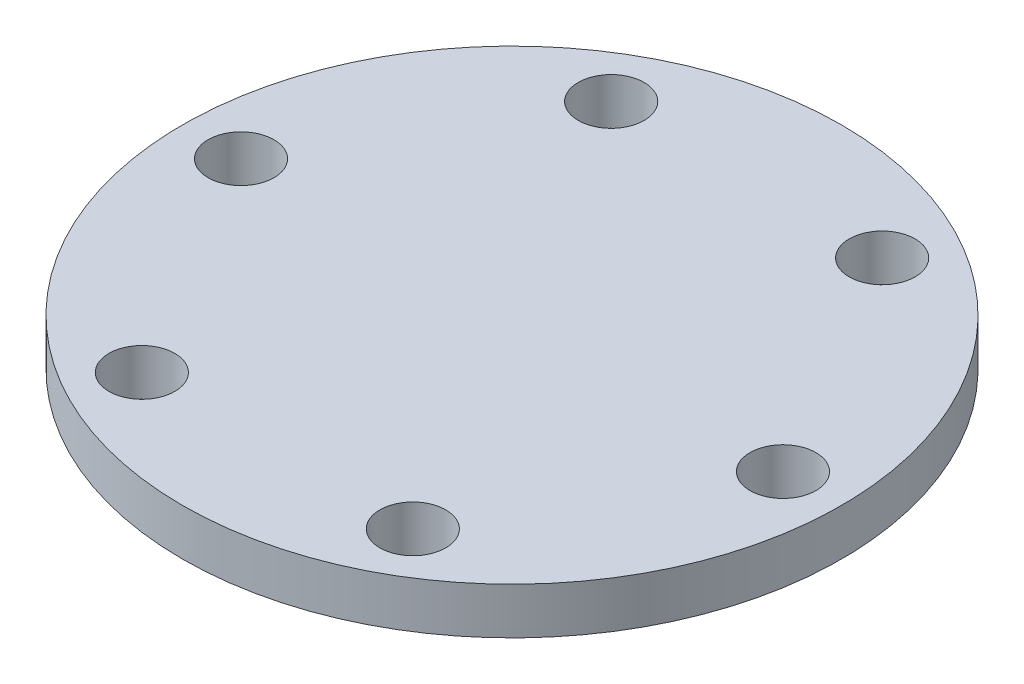
ISO-10303-21;
HEADER;
FILE_DESCRIPTION(('STEP AP214'),'2;1');
FILE_NAME('part.step','',(''),(''),'','','');
FILE_SCHEMA(('AUTOMOTIVE_DESIGN { 1 0 10303 214 1 1 1 1 }'));
ENDSEC;
DATA;
#1=APPLICATION_CONTEXT('core data for automotive mechanical design processes');
#2=APPLICATION_PROTOCOL_DEFINITION('international standard','automotive_design',2000,#1);
#3=PRODUCT_CONTEXT('',#1,'mechanical');
#4=PRODUCT('Part','Part','',(#3));
#5=PRODUCT_RELATED_PRODUCT_CATEGORY('part','',(#4));
#6=PRODUCT_DEFINITION_FORMATION('','',#4);
#7=PRODUCT_DEFINITION_CONTEXT('part definition',#1,'design');
#8=PRODUCT_DEFINITION('design','',#6,#7);
#9=PRODUCT_DEFINITION_SHAPE('','',#8);
#10=(LENGTH_UNIT() NAMED_UNIT(*) SI_UNIT(.MILLI.,.METRE.));
#11=(NAMED_UNIT(*) PLANE_ANGLE_UNIT() SI_UNIT($,.RADIAN.));
#12=(NAMED_UNIT(*) SI_UNIT($,.STERADIAN.) SOLID_ANGLE_UNIT());
#13=UNCERTAINTY_MEASURE_WITH_UNIT(LENGTH_MEASURE(1.E-05),#10,'distance_accuracy_value','');
#14=(GEOMETRIC_REPRESENTATION_CONTEXT(3) GLOBAL_UNCERTAINTY_ASSIGNED_CONTEXT((#13)) GLOBAL_UNIT_ASSIGNED_CONTEXT((#10,
#11,#12)) REPRESENTATION_CONTEXT('',''));
#15=CARTESIAN_POINT('',(0.,0.,0.));
#16=DIRECTION('',(0.,0.,1.));
#17=DIRECTION('',(1.,0.,0.));
#18=AXIS2_PLACEMENT_3D('',#15,#16,#17);
#19=CARTESIAN_POINT('',(18.5000000000009,233.315,-6.39585606698739E-13));
#20=DIRECTION('',(0.,1.,0.));
#21=DIRECTION('',(0.,0.,1.));
#22=AXIS2_PLACEMENT_3D('',#19,#20,#21);
#23=CYLINDRICAL_SURFACE('',#22,2.24999999999973);
#24=CARTESIAN_POINT('',(18.5000000000009,233.315,-6.39585606698739E-13));
#25=DIRECTION('',(0.,1.,0.));
#26=DIRECTION('',(0.,0.,1.));
#27=AXIS2_PLACEMENT_3D('',#24,#25,#26);
#28=CIRCLE('',#27,2.24999999999973);
#29=CARTESIAN_POINT('',(18.5000000000009,233.315,2.24999999999909));
#30=VERTEX_POINT('',#29);
#31=EDGE_CURVE('E52',#30,#30,#28,.T.);
#32=ORIENTED_EDGE('',*,*,#31,.F.);
#33=EDGE_LOOP('',(#32));
#34=FACE_BOUND('',#33,.T.);
#35=CARTESIAN_POINT('',(18.5000000000009,236.49,-6.39585606698739E-13));
#36=DIRECTION('',(0.,1.,0.));
#37=DIRECTION('',(0.,0.,1.));
#38=AXIS2_PLACEMENT_3D('',#35,#36,#37);
#39=CIRCLE('',#38,2.24999999999973);
#40=CARTESIAN_POINT('',(18.5000000000009,236.49,2.24999999999909));
#41=VERTEX_POINT('',#40);
#42=EDGE_CURVE('E81',#41,#41,#39,.T.);
#43=ORIENTED_EDGE('',*,*,#42,.T.);
#44=EDGE_LOOP('',(#43));
#45=FACE_BOUND('',#44,.T.);
#46=ADVANCED_FACE('F43',(#34,#45),#23,.F.);
#47=CARTESIAN_POINT('',(9.24999999999991,233.315,-16.0214699700122));
#48=DIRECTION('',(0.,1.,0.));
#49=DIRECTION('',(0.,0.,1.));
#50=AXIS2_PLACEMENT_3D('',#47,#48,#49);
#51=CYLINDRICAL_SURFACE('',#50,2.25);
#52=CARTESIAN_POINT('',(9.24999999999991,233.315,-16.0214699700122));
#53=DIRECTION('',(0.,1.,0.));
#54=DIRECTION('',(0.,0.,1.));
#55=AXIS2_PLACEMENT_3D('',#52,#53,#54);
#56=CIRCLE('',#55,2.25);
#57=CARTESIAN_POINT('',(9.24999999999991,233.315,-13.7714699700122));
#58=VERTEX_POINT('',#57);
#59=EDGE_CURVE('E58',#58,#58,#56,.T.);
#60=ORIENTED_EDGE('',*,*,#59,.F.);
#61=EDGE_LOOP('',(#60));
#62=FACE_BOUND('',#61,.T.);
#63=CARTESIAN_POINT('',(9.24999999999991,236.49,-16.0214699700122));
#64=DIRECTION('',(0.,1.,0.));
#65=DIRECTION('',(0.,0.,1.));
#66=AXIS2_PLACEMENT_3D('',#63,#64,#65);
#67=CIRCLE('',#66,2.25);
#68=CARTESIAN_POINT('',(9.24999999999991,236.49,-13.7714699700122));
#69=VERTEX_POINT('',#68);
#70=EDGE_CURVE('E78',#69,#69,#67,.T.);
#71=ORIENTED_EDGE('',*,*,#70,.T.);
#72=EDGE_LOOP('',(#71));
#73=FACE_BOUND('',#72,.T.);
#74=ADVANCED_FACE('F115',(#62,#73),#51,.F.);
#75=CARTESIAN_POINT('',(0.,233.315,0.));
#76=DIRECTION('',(0.,1.,0.));
#77=DIRECTION('',(0.,0.,1.));
#78=AXIS2_PLACEMENT_3D('',#75,#76,#77);
#79=CYLINDRICAL_SURFACE('',#78,22.5);
#80=CARTESIAN_POINT('',(0.,233.315,0.));
#81=DIRECTION('',(0.,1.,0.));
#82=DIRECTION('',(0.,0.,1.));
#83=AXIS2_PLACEMENT_3D('',#80,#81,#82);
#84=CIRCLE('',#83,22.5);
#85=CARTESIAN_POINT('',(0.,233.315,22.5));
#86=VERTEX_POINT('',#85);
#87=EDGE_CURVE('E105',#86,#86,#84,.T.);
#88=ORIENTED_EDGE('',*,*,#87,.T.);
#89=EDGE_LOOP('',(#88));
#90=FACE_BOUND('',#89,.T.);
#91=CARTESIAN_POINT('',(0.,236.49,0.));
#92=DIRECTION('',(0.,1.,0.));
#93=DIRECTION('',(0.,0.,1.));
#94=AXIS2_PLACEMENT_3D('',#91,#92,#93);
#95=CIRCLE('',#94,22.5);
#96=CARTESIAN_POINT('',(0.,236.49,22.5));
#97=VERTEX_POINT('',#96);
#98=EDGE_CURVE('E74',#97,#97,#95,.T.);
#99=ORIENTED_EDGE('',*,*,#98,.F.);
#100=EDGE_LOOP('',(#99));
#101=FACE_BOUND('',#100,.T.);
#102=ADVANCED_FACE('F118',(#90,#101),#79,.T.);
#103=CARTESIAN_POINT('',(-18.4999999999991,233.315,1.68829830522852E-12));
#104=DIRECTION('',(0.,1.,0.));
#105=DIRECTION('',(0.,0.,1.));
#106=AXIS2_PLACEMENT_3D('',#103,#104,#105);
#107=CYLINDRICAL_SURFACE('',#106,2.25000000000184);
#108=CARTESIAN_POINT('',(-18.4999999999991,233.315,1.68829830522852E-12));
#109=DIRECTION('',(0.,1.,0.));
#110=DIRECTION('',(0.,0.,1.));
#111=AXIS2_PLACEMENT_3D('',#108,#109,#110);
#112=CIRCLE('',#111,2.25000000000184);
#113=CARTESIAN_POINT('',(-18.4999999999991,233.315,2.25000000000353));
#114=VERTEX_POINT('',#113);
#115=EDGE_CURVE('E99',#114,#114,#112,.T.);
#116=ORIENTED_EDGE('',*,*,#115,.F.);
#117=EDGE_LOOP('',(#116));
#118=FACE_BOUND('',#117,.T.);
#119=CARTESIAN_POINT('',(-18.4999999999991,236.49,1.68829830522852E-12));
#120=DIRECTION('',(0.,1.,0.));
#121=DIRECTION('',(0.,0.,1.));
#122=AXIS2_PLACEMENT_3D('',#119,#120,#121);
#123=CIRCLE('',#122,2.25000000000184);
#124=CARTESIAN_POINT('',(-18.4999999999991,236.49,2.25000000000353));
#125=VERTEX_POINT('',#124);
#126=EDGE_CURVE('E70',#125,#125,#123,.T.);
#127=ORIENTED_EDGE('',*,*,#126,.T.);
#128=EDGE_LOOP('',(#127));
#129=FACE_BOUND('',#128,.T.);
#130=ADVANCED_FACE('F145',(#118,#129),#107,.F.);
#131=CARTESIAN_POINT('',(-9.2499999999981,233.315,16.0214699700132));
#132=DIRECTION('',(0.,1.,0.));
#133=DIRECTION('',(0.,0.,1.));
#134=AXIS2_PLACEMENT_3D('',#131,#132,#133);
#135=CYLINDRICAL_SURFACE('',#134,2.25000000000151);
#136=CARTESIAN_POINT('',(-9.2499999999981,233.315,16.0214699700132));
#137=DIRECTION('',(0.,1.,0.));
#138=DIRECTION('',(0.,0.,1.));
#139=AXIS2_PLACEMENT_3D('',#136,#137,#138);
#140=CIRCLE('',#139,2.25000000000151);
#141=CARTESIAN_POINT('',(-9.2499999999981,233.315,18.2714699700147));
#142=VERTEX_POINT('',#141);
#143=EDGE_CURVE('E93',#142,#142,#140,.T.);
#144=ORIENTED_EDGE('',*,*,#143,.F.);
#145=EDGE_LOOP('',(#144));
#146=FACE_BOUND('',#145,.T.);
#147=CARTESIAN_POINT('',(-9.2499999999981,236.49,16.0214699700132));
#148=DIRECTION('',(0.,1.,0.));
#149=DIRECTION('',(0.,0.,1.));
#150=AXIS2_PLACEMENT_3D('',#147,#148,#149);
#151=CIRCLE('',#150,2.25000000000151);
#152=CARTESIAN_POINT('',(-9.2499999999981,236.49,18.2714699700147));
#153=VERTEX_POINT('',#152);
#154=EDGE_CURVE('E66',#153,#153,#151,.T.);
#155=ORIENTED_EDGE('',*,*,#154,.T.);
#156=EDGE_LOOP('',(#155));
#157=FACE_BOUND('',#156,.T.);
#158=ADVANCED_FACE('F148',(#146,#157),#135,.F.);
#159=CARTESIAN_POINT('',(-9.25000000000011,233.315,-16.021469970011));
#160=DIRECTION('',(0.,1.,0.));
#161=DIRECTION('',(0.,0.,1.));
#162=AXIS2_PLACEMENT_3D('',#159,#160,#161);
#163=CYLINDRICAL_SURFACE('',#162,2.25000000000118);
#164=CARTESIAN_POINT('',(-9.25000000000011,233.315,-16.021469970011));
#165=DIRECTION('',(0.,1.,0.));
#166=DIRECTION('',(0.,0.,1.));
#167=AXIS2_PLACEMENT_3D('',#164,#165,#166);
#168=CIRCLE('',#167,2.25000000000118);
#169=CARTESIAN_POINT('',(-9.25000000000011,233.315,-13.7714699700098));
#170=VERTEX_POINT('',#169);
#171=EDGE_CURVE('E88',#170,#170,#168,.T.);
#172=ORIENTED_EDGE('',*,*,#171,.F.);
#173=EDGE_LOOP('',(#172));
#174=FACE_BOUND('',#173,.T.);
#175=CARTESIAN_POINT('',(-9.25000000000011,236.49,-16.021469970011));
#176=DIRECTION('',(0.,1.,0.));
#177=DIRECTION('',(0.,0.,1.));
#178=AXIS2_PLACEMENT_3D('',#175,#176,#177);
#179=CIRCLE('',#178,2.25000000000118);
#180=CARTESIAN_POINT('',(-9.25000000000011,236.49,-13.7714699700098));
#181=VERTEX_POINT('',#180);
#182=EDGE_CURVE('E62',#181,#181,#179,.T.);
#183=ORIENTED_EDGE('',*,*,#182,.T.);
#184=EDGE_LOOP('',(#183));
#185=FACE_BOUND('',#184,.T.);
#186=ADVANCED_FACE('F45',(#174,#185),#163,.F.);
#187=CARTESIAN_POINT('',(9.25000000000191,233.315,16.0214699700121));
#188=DIRECTION('',(0.,1.,0.));
#189=DIRECTION('',(0.,0.,1.));
#190=AXIS2_PLACEMENT_3D('',#187,#188,#189);
#191=CYLINDRICAL_SURFACE('',#190,2.25000000000046);
#192=CARTESIAN_POINT('',(9.25000000000191,233.315,16.0214699700121));
#193=DIRECTION('',(0.,1.,0.));
#194=DIRECTION('',(0.,0.,1.));
#195=AXIS2_PLACEMENT_3D('',#192,#193,#194);
#196=CIRCLE('',#195,2.25000000000046);
#197=CARTESIAN_POINT('',(9.25000000000191,233.315,18.2714699700125));
#198=VERTEX_POINT('',#197);
#199=EDGE_CURVE('E10',#198,#198,#196,.T.);
#200=ORIENTED_EDGE('',*,*,#199,.F.);
#201=EDGE_LOOP('',(#200));
#202=FACE_BOUND('',#201,.T.);
#203=CARTESIAN_POINT('',(9.25000000000191,236.49,16.0214699700121));
#204=DIRECTION('',(0.,1.,0.));
#205=DIRECTION('',(0.,0.,1.));
#206=AXIS2_PLACEMENT_3D('',#203,#204,#205);
#207=CIRCLE('',#206,2.25000000000046);
#208=CARTESIAN_POINT('',(9.25000000000191,236.49,18.2714699700125));
#209=VERTEX_POINT('',#208);
#210=EDGE_CURVE('E47',#209,#209,#207,.T.);
#211=ORIENTED_EDGE('',*,*,#210,.T.);
#212=EDGE_LOOP('',(#211));
#213=FACE_BOUND('',#212,.T.);
#214=ADVANCED_FACE('F131',(#202,#213),#191,.F.);
#215=CARTESIAN_POINT('',(0.,233.315,0.));
#216=DIRECTION('',(0.,1.,0.));
#217=DIRECTION('',(0.,0.,1.));
#218=AXIS2_PLACEMENT_3D('',#215,#216,#217);
#219=PLANE('',#218);
#220=ORIENTED_EDGE('',*,*,#171,.T.);
#221=EDGE_LOOP('',(#220));
#222=FACE_BOUND('',#221,.T.);
#223=ORIENTED_EDGE('',*,*,#143,.T.);
#224=EDGE_LOOP('',(#223));
#225=FACE_BOUND('',#224,.T.);
#226=ORIENTED_EDGE('',*,*,#115,.T.);
#227=EDGE_LOOP('',(#226));
#228=FACE_BOUND('',#227,.T.);
#229=ORIENTED_EDGE('',*,*,#87,.F.);
#230=EDGE_LOOP('',(#229));
#231=FACE_BOUND('',#230,.T.);
#232=ORIENTED_EDGE('',*,*,#59,.T.);
#233=EDGE_LOOP('',(#232));
#234=FACE_BOUND('',#233,.T.);
#235=ORIENTED_EDGE('',*,*,#31,.T.);
#236=EDGE_LOOP('',(#235));
#237=FACE_BOUND('',#236,.T.);
#238=ORIENTED_EDGE('',*,*,#199,.T.);
#239=EDGE_LOOP('',(#238));
#240=FACE_BOUND('',#239,.T.);
#241=ADVANCED_FACE('F112',(#222,#225,#228,#231,#234,#237,#240),#219,.F.);
#242=CARTESIAN_POINT('',(0.,236.49,0.));
#243=DIRECTION('',(0.,1.,0.));
#244=DIRECTION('',(0.,0.,1.));
#245=AXIS2_PLACEMENT_3D('',#242,#243,#244);
#246=PLANE('',#245);
#247=ORIENTED_EDGE('',*,*,#182,.F.);
#248=EDGE_LOOP('',(#247));
#249=FACE_BOUND('',#248,.T.);
#250=ORIENTED_EDGE('',*,*,#154,.F.);
#251=EDGE_LOOP('',(#250));
#252=FACE_BOUND('',#251,.T.);
#253=ORIENTED_EDGE('',*,*,#126,.F.);
#254=EDGE_LOOP('',(#253));
#255=FACE_BOUND('',#254,.T.);
#256=ORIENTED_EDGE('',*,*,#98,.T.);
#257=EDGE_LOOP('',(#256));
#258=FACE_BOUND('',#257,.T.);
#259=ORIENTED_EDGE('',*,*,#70,.F.);
#260=EDGE_LOOP('',(#259));
#261=FACE_BOUND('',#260,.T.);
#262=ORIENTED_EDGE('',*,*,#42,.F.);
#263=EDGE_LOOP('',(#262));
#264=FACE_BOUND('',#263,.T.);
#265=ORIENTED_EDGE('',*,*,#210,.F.);
#266=EDGE_LOOP('',(#265));
#267=FACE_BOUND('',#266,.T.);
#268=ADVANCED_FACE('F122',(#249,#252,#255,#258,#261,#264,#267),#246,.T.);
#269=CLOSED_SHELL('',(#46,#74,#102,#130,#158,#186,#214,#241,#268));
#270=MANIFOLD_SOLID_BREP('B2',#269);
#271=ADVANCED_BREP_SHAPE_REPRESENTATION('',(#18,#270),#14);
#272=SHAPE_DEFINITION_REPRESENTATION(#9,#271);
ENDSEC;
END-ISO-10303-21;
